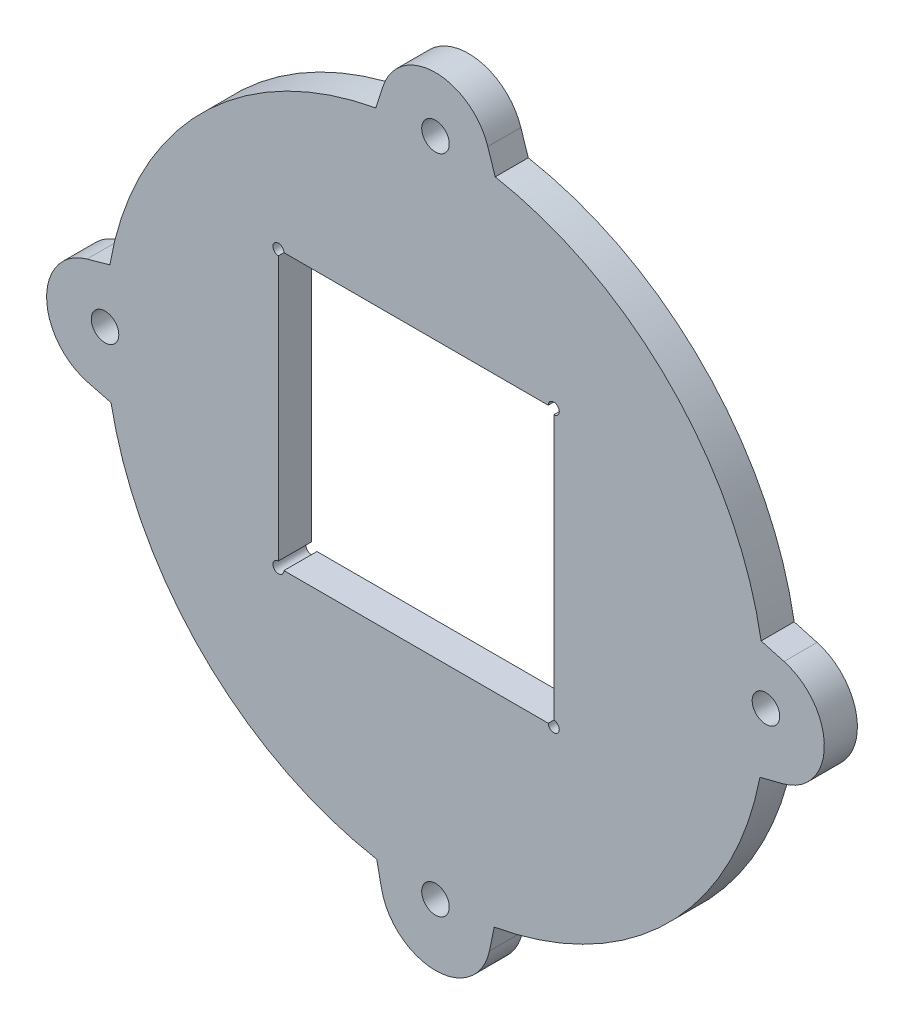
ISO-10303-21;
HEADER;
FILE_DESCRIPTION(('STEP AP214'),'2;1');
FILE_NAME('part.step','',(''),(''),'','','');
FILE_SCHEMA(('AUTOMOTIVE_DESIGN { 1 0 10303 214 1 1 1 1 }'));
ENDSEC;
DATA;
#1=APPLICATION_CONTEXT('core data for automotive mechanical design processes');
#2=APPLICATION_PROTOCOL_DEFINITION('international standard','automotive_design',2000,#1);
#3=PRODUCT_CONTEXT('',#1,'mechanical');
#4=PRODUCT('Part','Part','',(#3));
#5=PRODUCT_RELATED_PRODUCT_CATEGORY('part','',(#4));
#6=PRODUCT_DEFINITION_FORMATION('','',#4);
#7=PRODUCT_DEFINITION_CONTEXT('part definition',#1,'design');
#8=PRODUCT_DEFINITION('design','',#6,#7);
#9=PRODUCT_DEFINITION_SHAPE('','',#8);
#10=(LENGTH_UNIT() NAMED_UNIT(*) SI_UNIT(.MILLI.,.METRE.));
#11=(NAMED_UNIT(*) PLANE_ANGLE_UNIT() SI_UNIT($,.RADIAN.));
#12=(NAMED_UNIT(*) SI_UNIT($,.STERADIAN.) SOLID_ANGLE_UNIT());
#13=UNCERTAINTY_MEASURE_WITH_UNIT(LENGTH_MEASURE(1.E-05),#10,'distance_accuracy_value','');
#14=(GEOMETRIC_REPRESENTATION_CONTEXT(3) GLOBAL_UNCERTAINTY_ASSIGNED_CONTEXT((#13)) GLOBAL_UNIT_ASSIGNED_CONTEXT((#10,
#11,#12)) REPRESENTATION_CONTEXT('',''));
#15=CARTESIAN_POINT('',(0.,0.,0.));
#16=DIRECTION('',(0.,0.,1.));
#17=DIRECTION('',(1.,0.,0.));
#18=AXIS2_PLACEMENT_3D('',#15,#16,#17);
#19=CARTESIAN_POINT('',(-1.85100391915683,25.9314962864006,3.));
#20=DIRECTION('',(0.,0.,-1.));
#21=DIRECTION('',(-1.,0.,0.));
#22=AXIS2_PLACEMENT_3D('',#19,#20,#21);
#23=PLANE('',#22);
#24=CARTESIAN_POINT('',(-1.85100391915683,25.9314962864006,3.));
#25=DIRECTION('',(0.,0.,1.));
#26=DIRECTION('',(1.,0.,0.));
#27=AXIS2_PLACEMENT_3D('',#24,#25,#26);
#28=CIRCLE('',#27,1.25);
#29=CARTESIAN_POINT('',(-0.601003919156824,25.9314962864006,3.));
#30=VERTEX_POINT('',#29);
#31=EDGE_CURVE('E243',#30,#30,#28,.T.);
#32=ORIENTED_EDGE('',*,*,#31,.F.);
#33=EDGE_LOOP('',(#32));
#34=FACE_BOUND('',#33,.T.);
#35=CARTESIAN_POINT('',(-1.85100391915683,25.9314962864006,3.));
#36=DIRECTION('',(0.,0.,1.));
#37=DIRECTION('',(-1.,0.,0.));
#38=AXIS2_PLACEMENT_3D('',#35,#36,#37);
#39=CIRCLE('',#38,5.);
#40=CARTESIAN_POINT('',(2.90088453214125,27.4869885385253,3.));
#41=VERTEX_POINT('',#40);
#42=CARTESIAN_POINT('',(-6.6028923704549,27.4869885385253,3.));
#43=VERTEX_POINT('',#42);
#44=EDGE_CURVE('E249',#41,#43,#39,.T.);
#45=ORIENTED_EDGE('',*,*,#44,.T.);
#46=DIRECTION('',(-0.311098450424942,-0.950377690259614,0.));
#47=VECTOR('',#46,1.);
#48=CARTESIAN_POINT('',(-6.6028923704549,27.4869885385253,3.));
#49=LINE('',#48,#47);
#50=CARTESIAN_POINT('',(-7.27383908397797,25.4373068798274,3.));
#51=VERTEX_POINT('',#50);
#52=EDGE_CURVE('E252',#43,#51,#49,.T.);
#53=ORIENTED_EDGE('',*,*,#52,.T.);
#54=CARTESIAN_POINT('',(-1.85100391915683,-4.06850371359943,3.));
#55=DIRECTION('',(0.,0.,1.));
#56=DIRECTION('',(-1.,0.,0.));
#57=AXIS2_PLACEMENT_3D('',#54,#55,#56);
#58=CIRCLE('',#57,30.);
#59=CARTESIAN_POINT('',(-31.4155105613768,1.02462371482118,3.));
#60=VERTEX_POINT('',#59);
#61=EDGE_CURVE('E255',#51,#60,#58,.T.);
#62=ORIENTED_EDGE('',*,*,#61,.T.);
#63=DIRECTION('',(-0.963403571369794,-0.268055141103332,0.));
#64=VECTOR('',#63,1.);
#65=CARTESIAN_POINT('',(-33.493285166567,0.446508601356048,3.));
#66=LINE('',#65,#64);
#67=CARTESIAN_POINT('',(-33.493285166567,0.446508601356048,3.));
#68=VERTEX_POINT('',#67);
#69=EDGE_CURVE('E257',#60,#68,#66,.T.);
#70=ORIENTED_EDGE('',*,*,#69,.T.);
#71=CARTESIAN_POINT('',(-32.1530094610503,-4.37050925549292,3.));
#72=DIRECTION('',(0.,0.,1.));
#73=DIRECTION('',(-1.,0.,0.));
#74=AXIS2_PLACEMENT_3D('',#71,#72,#73);
#75=CIRCLE('',#74,5.);
#76=CARTESIAN_POINT('',(-33.3970106575512,-9.21328335956842,3.));
#77=VERTEX_POINT('',#76);
#78=EDGE_CURVE('E259',#68,#77,#75,.T.);
#79=ORIENTED_EDGE('',*,*,#78,.T.);
#80=DIRECTION('',(0.968554820815099,-0.248800239300188,0.));
#81=VECTOR('',#80,1.);
#82=CARTESIAN_POINT('',(-33.3970106575512,-9.21328335956842,3.));
#83=LINE('',#82,#81);
#84=CARTESIAN_POINT('',(-31.3081263413319,-9.7498713838874,3.));
#85=VERTEX_POINT('',#84);
#86=EDGE_CURVE('E261',#77,#85,#83,.T.);
#87=ORIENTED_EDGE('',*,*,#86,.T.);
#88=CARTESIAN_POINT('',(-1.85100391915685,-4.06850371359944,3.));
#89=DIRECTION('',(0.,0.,1.));
#90=DIRECTION('',(-1.,0.,0.));
#91=AXIS2_PLACEMENT_3D('',#88,#89,#90);
#92=CIRCLE('',#91,30.);
#93=CARTESIAN_POINT('',(-7.18763088119864,-33.5900282790416,3.));
#94=VERTEX_POINT('',#93);
#95=EDGE_CURVE('E263',#85,#94,#92,.T.);
#96=ORIENTED_EDGE('',*,*,#95,.T.);
#97=DIRECTION('',(0.205625699216915,-0.978630712690724,0.));
#98=VECTOR('',#97,1.);
#99=CARTESIAN_POINT('',(-6.74415748261043,-35.700643293471,3.));
#100=LINE('',#99,#98);
#101=CARTESIAN_POINT('',(-6.74415748261043,-35.700643293471,3.));
#102=VERTEX_POINT('',#101);
#103=EDGE_CURVE('E265',#94,#102,#100,.T.);
#104=ORIENTED_EDGE('',*,*,#103,.T.);
#105=CARTESIAN_POINT('',(-1.85100391915681,-34.6725147973864,3.));
#106=DIRECTION('',(0.,0.,1.));
#107=DIRECTION('',(-1.,0.,0.));
#108=AXIS2_PLACEMENT_3D('',#105,#106,#107);
#109=CIRCLE('',#108,5.);
#110=CARTESIAN_POINT('',(3.04214964429681,-35.700643293471,3.));
#111=VERTEX_POINT('',#110);
#112=EDGE_CURVE('E267',#102,#111,#109,.T.);
#113=ORIENTED_EDGE('',*,*,#112,.T.);
#114=DIRECTION('',(0.205625699216913,0.978630712690724,0.));
#115=VECTOR('',#114,1.);
#116=CARTESIAN_POINT('',(3.04214964429681,-35.700643293471,3.));
#117=LINE('',#116,#115);
#118=CARTESIAN_POINT('',(3.48562304288501,-33.5900282790416,3.));
#119=VERTEX_POINT('',#118);
#120=EDGE_CURVE('E269',#111,#119,#117,.T.);
#121=ORIENTED_EDGE('',*,*,#120,.T.);
#122=CARTESIAN_POINT('',(-1.85100391915683,-4.06850371359943,3.));
#123=DIRECTION('',(0.,0.,1.));
#124=DIRECTION('',(-1.,0.,0.));
#125=AXIS2_PLACEMENT_3D('',#122,#123,#124);
#126=CIRCLE('',#125,30.);
#127=CARTESIAN_POINT('',(27.6061185030182,-9.74987138388738,3.));
#128=VERTEX_POINT('',#127);
#129=EDGE_CURVE('E271',#119,#128,#126,.T.);
#130=ORIENTED_EDGE('',*,*,#129,.T.);
#131=DIRECTION('',(0.9685548208151,0.248800239300185,0.));
#132=VECTOR('',#131,1.);
#133=CARTESIAN_POINT('',(29.6950028192376,-9.21328335956842,3.));
#134=LINE('',#133,#132);
#135=CARTESIAN_POINT('',(29.6950028192376,-9.21328335956842,3.));
#136=VERTEX_POINT('',#135);
#137=EDGE_CURVE('E273',#128,#136,#134,.T.);
#138=ORIENTED_EDGE('',*,*,#137,.T.);
#139=CARTESIAN_POINT('',(28.4510016227367,-4.37050925549292,3.));
#140=DIRECTION('',(0.,0.,1.));
#141=DIRECTION('',(-1.,0.,0.));
#142=AXIS2_PLACEMENT_3D('',#139,#140,#141);
#143=CIRCLE('',#142,5.);
#144=CARTESIAN_POINT('',(29.7912773282533,0.446508601356054,3.));
#145=VERTEX_POINT('',#144);
#146=EDGE_CURVE('E275',#136,#145,#143,.T.);
#147=ORIENTED_EDGE('',*,*,#146,.T.);
#148=DIRECTION('',(-0.963403571369794,0.26805514110333,0.));
#149=VECTOR('',#148,1.);
#150=CARTESIAN_POINT('',(29.7912773282533,0.446508601356054,3.));
#151=LINE('',#150,#149);
#152=CARTESIAN_POINT('',(27.7135027230632,1.02462371482119,3.));
#153=VERTEX_POINT('',#152);
#154=EDGE_CURVE('E277',#145,#153,#151,.T.);
#155=ORIENTED_EDGE('',*,*,#154,.T.);
#156=CARTESIAN_POINT('',(-1.85100391915683,-4.06850371359943,3.));
#157=DIRECTION('',(0.,0.,1.));
#158=DIRECTION('',(-1.,0.,0.));
#159=AXIS2_PLACEMENT_3D('',#156,#157,#158);
#160=CIRCLE('',#159,30.);
#161=CARTESIAN_POINT('',(3.57183124566432,25.4373068798274,3.));
#162=VERTEX_POINT('',#161);
#163=EDGE_CURVE('E279',#153,#162,#160,.T.);
#164=ORIENTED_EDGE('',*,*,#163,.T.);
#165=DIRECTION('',(-0.311098450424942,0.950377690259614,0.));
#166=VECTOR('',#165,1.);
#167=CARTESIAN_POINT('',(2.90088453214125,27.4869885385253,3.));
#168=LINE('',#167,#166);
#169=EDGE_CURVE('E281',#162,#41,#168,.T.);
#170=ORIENTED_EDGE('',*,*,#169,.T.);
#171=EDGE_LOOP('',(#45,#53,#62,#70,#79,#87,#96,#104,#113,#121,#130,#138,#147,#155,#164,#170));
#172=FACE_BOUND('',#171,.T.);
#173=DIRECTION('',(1.,0.,0.));
#174=VECTOR('',#173,1.);
#175=CARTESIAN_POINT('',(-16.1130746243856,-15.1084385502642,3.));
#176=LINE('',#175,#174);
#177=CARTESIAN_POINT('',(-15.6130746243856,-15.1084385502642,3.));
#178=VERTEX_POINT('',#177);
#179=CARTESIAN_POINT('',(8.38692537561444,-15.1084385502642,3.));
#180=VERTEX_POINT('',#179);
#181=EDGE_CURVE('E233',#178,#180,#176,.T.);
#182=ORIENTED_EDGE('',*,*,#181,.F.);
#183=CARTESIAN_POINT('',(-16.1130746243856,-15.1084385502642,3.));
#184=DIRECTION('',(0.,0.,1.));
#185=DIRECTION('',(1.,0.,0.));
#186=AXIS2_PLACEMENT_3D('',#183,#184,#185);
#187=CIRCLE('',#186,0.499999999999999);
#188=CARTESIAN_POINT('',(-16.1130746243856,-14.6084385502642,3.));
#189=VERTEX_POINT('',#188);
#190=EDGE_CURVE('E203',#189,#178,#187,.T.);
#191=ORIENTED_EDGE('',*,*,#190,.F.);
#192=DIRECTION('',(0.,-1.,0.));
#193=VECTOR('',#192,1.);
#194=CARTESIAN_POINT('',(-16.1130746243856,-15.1084385502642,3.));
#195=LINE('',#194,#193);
#196=CARTESIAN_POINT('',(-16.1130746243856,9.39156144973582,3.));
#197=VERTEX_POINT('',#196);
#198=EDGE_CURVE('E222',#197,#189,#195,.T.);
#199=ORIENTED_EDGE('',*,*,#198,.F.);
#200=CARTESIAN_POINT('',(-16.1130746243856,9.89156144973582,3.));
#201=DIRECTION('',(0.,0.,1.));
#202=DIRECTION('',(1.,0.,0.));
#203=AXIS2_PLACEMENT_3D('',#200,#201,#202);
#204=CIRCLE('',#203,0.499999999999999);
#205=CARTESIAN_POINT('',(-15.6130746243856,9.89156144973582,3.));
#206=VERTEX_POINT('',#205);
#207=EDGE_CURVE('E55',#206,#197,#204,.T.);
#208=ORIENTED_EDGE('',*,*,#207,.F.);
#209=DIRECTION('',(-1.,0.,0.));
#210=VECTOR('',#209,1.);
#211=CARTESIAN_POINT('',(-16.1130746243856,9.89156144973582,3.));
#212=LINE('',#211,#210);
#213=CARTESIAN_POINT('',(8.38692537561444,9.89156144973582,3.));
#214=VERTEX_POINT('',#213);
#215=EDGE_CURVE('E218',#214,#206,#212,.T.);
#216=ORIENTED_EDGE('',*,*,#215,.F.);
#217=CARTESIAN_POINT('',(8.88692537561444,9.89156144973582,3.));
#218=DIRECTION('',(0.,0.,1.));
#219=DIRECTION('',(1.,0.,0.));
#220=AXIS2_PLACEMENT_3D('',#217,#218,#219);
#221=CIRCLE('',#220,0.500000000000001);
#222=CARTESIAN_POINT('',(8.88692537561444,9.39156144973582,3.));
#223=VERTEX_POINT('',#222);
#224=EDGE_CURVE('E47',#223,#214,#221,.T.);
#225=ORIENTED_EDGE('',*,*,#224,.F.);
#226=DIRECTION('',(0.,1.,0.));
#227=VECTOR('',#226,1.);
#228=CARTESIAN_POINT('',(8.88692537561444,-15.1084385502642,3.));
#229=LINE('',#228,#227);
#230=CARTESIAN_POINT('',(8.88692537561444,-14.6084385502642,3.));
#231=VERTEX_POINT('',#230);
#232=EDGE_CURVE('E210',#231,#223,#229,.T.);
#233=ORIENTED_EDGE('',*,*,#232,.F.);
#234=CARTESIAN_POINT('',(8.88692537561444,-15.1084385502642,3.));
#235=DIRECTION('',(0.,0.,1.));
#236=DIRECTION('',(1.,0.,0.));
#237=AXIS2_PLACEMENT_3D('',#234,#235,#236);
#238=CIRCLE('',#237,0.500000000000001);
#239=EDGE_CURVE('E192',#180,#231,#238,.T.);
#240=ORIENTED_EDGE('',*,*,#239,.F.);
#241=EDGE_LOOP('',(#182,#191,#199,#208,#216,#225,#233,#240));
#242=FACE_BOUND('',#241,.T.);
#243=CARTESIAN_POINT('',(28.1489960808432,-4.06850371359943,3.));
#244=DIRECTION('',(0.,0.,1.));
#245=DIRECTION('',(1.,0.,0.));
#246=AXIS2_PLACEMENT_3D('',#243,#244,#245);
#247=CIRCLE('',#246,1.25);
#248=CARTESIAN_POINT('',(29.3989960808432,-4.06850371359943,3.));
#249=VERTEX_POINT('',#248);
#250=EDGE_CURVE('E238',#249,#249,#247,.T.);
#251=ORIENTED_EDGE('',*,*,#250,.F.);
#252=EDGE_LOOP('',(#251));
#253=FACE_BOUND('',#252,.T.);
#254=CARTESIAN_POINT('',(-1.85100391915682,-34.0685037135994,3.));
#255=DIRECTION('',(0.,0.,1.));
#256=DIRECTION('',(1.,0.,0.));
#257=AXIS2_PLACEMENT_3D('',#254,#255,#256);
#258=CIRCLE('',#257,1.25);
#259=CARTESIAN_POINT('',(-0.601003919156821,-34.0685037135994,3.));
#260=VERTEX_POINT('',#259);
#261=EDGE_CURVE('E399',#260,#260,#258,.T.);
#262=ORIENTED_EDGE('',*,*,#261,.F.);
#263=EDGE_LOOP('',(#262));
#264=FACE_BOUND('',#263,.T.);
#265=CARTESIAN_POINT('',(-31.8510039191568,-4.06850371359943,3.));
#266=DIRECTION('',(0.,0.,1.));
#267=DIRECTION('',(1.,0.,0.));
#268=AXIS2_PLACEMENT_3D('',#265,#266,#267);
#269=CIRCLE('',#268,1.25);
#270=CARTESIAN_POINT('',(-30.6010039191568,-4.06850371359943,3.));
#271=VERTEX_POINT('',#270);
#272=EDGE_CURVE('E393',#271,#271,#269,.T.);
#273=ORIENTED_EDGE('',*,*,#272,.F.);
#274=EDGE_LOOP('',(#273));
#275=FACE_BOUND('',#274,.T.);
#276=ADVANCED_FACE('F33',(#34,#172,#242,#253,#264,#275),#23,.F.);
#277=CARTESIAN_POINT('',(-1.85100391915683,25.9314962864006,0.));
#278=DIRECTION('',(0.,0.,-1.));
#279=DIRECTION('',(-1.,0.,0.));
#280=AXIS2_PLACEMENT_3D('',#277,#278,#279);
#281=PLANE('',#280);
#282=CARTESIAN_POINT('',(-16.1130746243856,-15.1084385502642,0.));
#283=DIRECTION('',(0.,0.,-1.));
#284=DIRECTION('',(-1.,0.,0.));
#285=AXIS2_PLACEMENT_3D('',#282,#283,#284);
#286=CIRCLE('',#285,0.499999999999999);
#287=CARTESIAN_POINT('',(-15.6130746243856,-15.1084385502642,0.));
#288=VERTEX_POINT('',#287);
#289=CARTESIAN_POINT('',(-16.1130746243856,-14.6084385502642,0.));
#290=VERTEX_POINT('',#289);
#291=EDGE_CURVE('E213',#288,#290,#286,.T.);
#292=ORIENTED_EDGE('',*,*,#291,.F.);
#293=DIRECTION('',(1.,0.,0.));
#294=VECTOR('',#293,1.);
#295=CARTESIAN_POINT('',(-16.1130746243856,-15.1084385502642,0.));
#296=LINE('',#295,#294);
#297=CARTESIAN_POINT('',(8.38692537561444,-15.1084385502642,0.));
#298=VERTEX_POINT('',#297);
#299=EDGE_CURVE('E219',#288,#298,#296,.T.);
#300=ORIENTED_EDGE('',*,*,#299,.T.);
#301=CARTESIAN_POINT('',(8.88692537561444,-15.1084385502642,0.));
#302=DIRECTION('',(0.,0.,-1.));
#303=DIRECTION('',(-1.,0.,0.));
#304=AXIS2_PLACEMENT_3D('',#301,#302,#303);
#305=CIRCLE('',#304,0.500000000000001);
#306=CARTESIAN_POINT('',(8.88692537561444,-14.6084385502642,0.));
#307=VERTEX_POINT('',#306);
#308=EDGE_CURVE('E214',#307,#298,#305,.T.);
#309=ORIENTED_EDGE('',*,*,#308,.F.);
#310=DIRECTION('',(0.,1.,0.));
#311=VECTOR('',#310,1.);
#312=CARTESIAN_POINT('',(8.88692537561444,-15.1084385502642,0.));
#313=LINE('',#312,#311);
#314=CARTESIAN_POINT('',(8.88692537561444,9.39156144973582,0.));
#315=VERTEX_POINT('',#314);
#316=EDGE_CURVE('E212',#307,#315,#313,.T.);
#317=ORIENTED_EDGE('',*,*,#316,.T.);
#318=CARTESIAN_POINT('',(8.88692537561444,9.89156144973582,0.));
#319=DIRECTION('',(0.,0.,-1.));
#320=DIRECTION('',(-1.,0.,0.));
#321=AXIS2_PLACEMENT_3D('',#318,#319,#320);
#322=CIRCLE('',#321,0.500000000000001);
#323=CARTESIAN_POINT('',(8.38692537561444,9.89156144973582,0.));
#324=VERTEX_POINT('',#323);
#325=EDGE_CURVE('E388',#324,#315,#322,.T.);
#326=ORIENTED_EDGE('',*,*,#325,.F.);
#327=DIRECTION('',(-1.,0.,0.));
#328=VECTOR('',#327,1.);
#329=CARTESIAN_POINT('',(-16.1130746243856,9.89156144973582,0.));
#330=LINE('',#329,#328);
#331=CARTESIAN_POINT('',(-15.6130746243856,9.89156144973582,0.));
#332=VERTEX_POINT('',#331);
#333=EDGE_CURVE('E237',#324,#332,#330,.T.);
#334=ORIENTED_EDGE('',*,*,#333,.T.);
#335=CARTESIAN_POINT('',(-16.1130746243856,9.89156144973582,0.));
#336=DIRECTION('',(0.,0.,-1.));
#337=DIRECTION('',(-1.,0.,0.));
#338=AXIS2_PLACEMENT_3D('',#335,#336,#337);
#339=CIRCLE('',#338,0.499999999999999);
#340=CARTESIAN_POINT('',(-16.1130746243856,9.39156144973582,0.));
#341=VERTEX_POINT('',#340);
#342=EDGE_CURVE('E366',#341,#332,#339,.T.);
#343=ORIENTED_EDGE('',*,*,#342,.F.);
#344=DIRECTION('',(0.,-1.,0.));
#345=VECTOR('',#344,1.);
#346=CARTESIAN_POINT('',(-16.1130746243856,-15.1084385502642,0.));
#347=LINE('',#346,#345);
#348=EDGE_CURVE('E225',#341,#290,#347,.T.);
#349=ORIENTED_EDGE('',*,*,#348,.T.);
#350=EDGE_LOOP('',(#292,#300,#309,#317,#326,#334,#343,#349));
#351=FACE_BOUND('',#350,.T.);
#352=CARTESIAN_POINT('',(-1.85100391915682,-34.0685037135994,0.));
#353=DIRECTION('',(0.,0.,1.));
#354=DIRECTION('',(1.,0.,0.));
#355=AXIS2_PLACEMENT_3D('',#352,#353,#354);
#356=CIRCLE('',#355,1.25);
#357=CARTESIAN_POINT('',(-0.601003919156821,-34.0685037135994,0.));
#358=VERTEX_POINT('',#357);
#359=EDGE_CURVE('E396',#358,#358,#356,.T.);
#360=ORIENTED_EDGE('',*,*,#359,.T.);
#361=EDGE_LOOP('',(#360));
#362=FACE_BOUND('',#361,.T.);
#363=CARTESIAN_POINT('',(-1.85100391915683,25.9314962864006,0.));
#364=DIRECTION('',(0.,0.,1.));
#365=DIRECTION('',(1.,0.,0.));
#366=AXIS2_PLACEMENT_3D('',#363,#364,#365);
#367=CIRCLE('',#366,1.25);
#368=CARTESIAN_POINT('',(-0.601003919156824,25.9314962864006,0.));
#369=VERTEX_POINT('',#368);
#370=EDGE_CURVE('E235',#369,#369,#367,.T.);
#371=ORIENTED_EDGE('',*,*,#370,.T.);
#372=EDGE_LOOP('',(#371));
#373=FACE_BOUND('',#372,.T.);
#374=CARTESIAN_POINT('',(-1.85100391915683,25.9314962864006,0.));
#375=DIRECTION('',(0.,0.,1.));
#376=DIRECTION('',(-1.,0.,0.));
#377=AXIS2_PLACEMENT_3D('',#374,#375,#376);
#378=CIRCLE('',#377,5.);
#379=CARTESIAN_POINT('',(2.90088453214125,27.4869885385253,0.));
#380=VERTEX_POINT('',#379);
#381=CARTESIAN_POINT('',(-6.6028923704549,27.4869885385253,0.));
#382=VERTEX_POINT('',#381);
#383=EDGE_CURVE('E246',#380,#382,#378,.T.);
#384=ORIENTED_EDGE('',*,*,#383,.F.);
#385=DIRECTION('',(-0.311098450424942,0.950377690259614,0.));
#386=VECTOR('',#385,1.);
#387=CARTESIAN_POINT('',(2.90088453214125,27.4869885385253,0.));
#388=LINE('',#387,#386);
#389=CARTESIAN_POINT('',(3.57183124566432,25.4373068798274,0.));
#390=VERTEX_POINT('',#389);
#391=EDGE_CURVE('E253',#390,#380,#388,.T.);
#392=ORIENTED_EDGE('',*,*,#391,.F.);
#393=CARTESIAN_POINT('',(-1.85100391915683,-4.06850371359943,0.));
#394=DIRECTION('',(0.,0.,1.));
#395=DIRECTION('',(-1.,0.,0.));
#396=AXIS2_PLACEMENT_3D('',#393,#394,#395);
#397=CIRCLE('',#396,30.);
#398=CARTESIAN_POINT('',(27.7135027230632,1.02462371482119,0.));
#399=VERTEX_POINT('',#398);
#400=EDGE_CURVE('E312',#399,#390,#397,.T.);
#401=ORIENTED_EDGE('',*,*,#400,.F.);
#402=DIRECTION('',(-0.963403571369794,0.26805514110333,0.));
#403=VECTOR('',#402,1.);
#404=CARTESIAN_POINT('',(29.7912773282533,0.446508601356054,0.));
#405=LINE('',#404,#403);
#406=CARTESIAN_POINT('',(29.7912773282533,0.446508601356054,0.));
#407=VERTEX_POINT('',#406);
#408=EDGE_CURVE('E310',#407,#399,#405,.T.);
#409=ORIENTED_EDGE('',*,*,#408,.F.);
#410=CARTESIAN_POINT('',(28.4510016227367,-4.37050925549292,0.));
#411=DIRECTION('',(0.,0.,1.));
#412=DIRECTION('',(-1.,0.,0.));
#413=AXIS2_PLACEMENT_3D('',#410,#411,#412);
#414=CIRCLE('',#413,5.);
#415=CARTESIAN_POINT('',(29.6950028192376,-9.21328335956842,0.));
#416=VERTEX_POINT('',#415);
#417=EDGE_CURVE('E308',#416,#407,#414,.T.);
#418=ORIENTED_EDGE('',*,*,#417,.F.);
#419=DIRECTION('',(0.9685548208151,0.248800239300185,0.));
#420=VECTOR('',#419,1.);
#421=CARTESIAN_POINT('',(29.6950028192376,-9.21328335956842,0.));
#422=LINE('',#421,#420);
#423=CARTESIAN_POINT('',(27.6061185030182,-9.74987138388738,0.));
#424=VERTEX_POINT('',#423);
#425=EDGE_CURVE('E306',#424,#416,#422,.T.);
#426=ORIENTED_EDGE('',*,*,#425,.F.);
#427=CARTESIAN_POINT('',(-1.85100391915683,-4.06850371359943,0.));
#428=DIRECTION('',(0.,0.,1.));
#429=DIRECTION('',(-1.,0.,0.));
#430=AXIS2_PLACEMENT_3D('',#427,#428,#429);
#431=CIRCLE('',#430,30.);
#432=CARTESIAN_POINT('',(3.48562304288501,-33.5900282790416,0.));
#433=VERTEX_POINT('',#432);
#434=EDGE_CURVE('E304',#433,#424,#431,.T.);
#435=ORIENTED_EDGE('',*,*,#434,.F.);
#436=DIRECTION('',(0.205625699216913,0.978630712690724,0.));
#437=VECTOR('',#436,1.);
#438=CARTESIAN_POINT('',(3.04214964429681,-35.700643293471,0.));
#439=LINE('',#438,#437);
#440=CARTESIAN_POINT('',(3.04214964429681,-35.700643293471,0.));
#441=VERTEX_POINT('',#440);
#442=EDGE_CURVE('E302',#441,#433,#439,.T.);
#443=ORIENTED_EDGE('',*,*,#442,.F.);
#444=CARTESIAN_POINT('',(-1.85100391915681,-34.6725147973864,0.));
#445=DIRECTION('',(0.,0.,1.));
#446=DIRECTION('',(-1.,0.,0.));
#447=AXIS2_PLACEMENT_3D('',#444,#445,#446);
#448=CIRCLE('',#447,5.);
#449=CARTESIAN_POINT('',(-6.74415748261043,-35.700643293471,0.));
#450=VERTEX_POINT('',#449);
#451=EDGE_CURVE('E300',#450,#441,#448,.T.);
#452=ORIENTED_EDGE('',*,*,#451,.F.);
#453=DIRECTION('',(0.205625699216915,-0.978630712690724,0.));
#454=VECTOR('',#453,1.);
#455=CARTESIAN_POINT('',(-6.74415748261043,-35.700643293471,0.));
#456=LINE('',#455,#454);
#457=CARTESIAN_POINT('',(-7.18763088119864,-33.5900282790416,0.));
#458=VERTEX_POINT('',#457);
#459=EDGE_CURVE('E298',#458,#450,#456,.T.);
#460=ORIENTED_EDGE('',*,*,#459,.F.);
#461=CARTESIAN_POINT('',(-1.85100391915685,-4.06850371359944,0.));
#462=DIRECTION('',(0.,0.,1.));
#463=DIRECTION('',(-1.,0.,0.));
#464=AXIS2_PLACEMENT_3D('',#461,#462,#463);
#465=CIRCLE('',#464,30.);
#466=CARTESIAN_POINT('',(-31.3081263413319,-9.7498713838874,0.));
#467=VERTEX_POINT('',#466);
#468=EDGE_CURVE('E296',#467,#458,#465,.T.);
#469=ORIENTED_EDGE('',*,*,#468,.F.);
#470=DIRECTION('',(0.968554820815099,-0.248800239300188,0.));
#471=VECTOR('',#470,1.);
#472=CARTESIAN_POINT('',(-33.3970106575512,-9.21328335956842,0.));
#473=LINE('',#472,#471);
#474=CARTESIAN_POINT('',(-33.3970106575512,-9.21328335956842,0.));
#475=VERTEX_POINT('',#474);
#476=EDGE_CURVE('E294',#475,#467,#473,.T.);
#477=ORIENTED_EDGE('',*,*,#476,.F.);
#478=CARTESIAN_POINT('',(-32.1530094610503,-4.37050925549292,0.));
#479=DIRECTION('',(0.,0.,1.));
#480=DIRECTION('',(-1.,0.,0.));
#481=AXIS2_PLACEMENT_3D('',#478,#479,#480);
#482=CIRCLE('',#481,5.);
#483=CARTESIAN_POINT('',(-33.493285166567,0.446508601356048,0.));
#484=VERTEX_POINT('',#483);
#485=EDGE_CURVE('E292',#484,#475,#482,.T.);
#486=ORIENTED_EDGE('',*,*,#485,.F.);
#487=DIRECTION('',(-0.963403571369794,-0.268055141103332,0.));
#488=VECTOR('',#487,1.);
#489=CARTESIAN_POINT('',(-33.493285166567,0.446508601356048,0.));
#490=LINE('',#489,#488);
#491=CARTESIAN_POINT('',(-31.4155105613768,1.02462371482118,0.));
#492=VERTEX_POINT('',#491);
#493=EDGE_CURVE('E290',#492,#484,#490,.T.);
#494=ORIENTED_EDGE('',*,*,#493,.F.);
#495=CARTESIAN_POINT('',(-1.85100391915683,-4.06850371359943,0.));
#496=DIRECTION('',(0.,0.,1.));
#497=DIRECTION('',(-1.,0.,0.));
#498=AXIS2_PLACEMENT_3D('',#495,#496,#497);
#499=CIRCLE('',#498,30.);
#500=CARTESIAN_POINT('',(-7.27383908397797,25.4373068798274,0.));
#501=VERTEX_POINT('',#500);
#502=EDGE_CURVE('E288',#501,#492,#499,.T.);
#503=ORIENTED_EDGE('',*,*,#502,.F.);
#504=DIRECTION('',(-0.311098450424942,-0.950377690259614,0.));
#505=VECTOR('',#504,1.);
#506=CARTESIAN_POINT('',(-6.6028923704549,27.4869885385253,0.));
#507=LINE('',#506,#505);
#508=EDGE_CURVE('E286',#382,#501,#507,.T.);
#509=ORIENTED_EDGE('',*,*,#508,.F.);
#510=EDGE_LOOP('',(#384,#392,#401,#409,#418,#426,#435,#443,#452,#460,#469,#477,#486,#494,#503,#509));
#511=FACE_BOUND('',#510,.T.);
#512=CARTESIAN_POINT('',(28.1489960808432,-4.06850371359943,0.));
#513=DIRECTION('',(0.,0.,1.));
#514=DIRECTION('',(1.,0.,0.));
#515=AXIS2_PLACEMENT_3D('',#512,#513,#514);
#516=CIRCLE('',#515,1.25);
#517=CARTESIAN_POINT('',(29.3989960808432,-4.06850371359943,0.));
#518=VERTEX_POINT('',#517);
#519=EDGE_CURVE('E228',#518,#518,#516,.T.);
#520=ORIENTED_EDGE('',*,*,#519,.T.);
#521=EDGE_LOOP('',(#520));
#522=FACE_BOUND('',#521,.T.);
#523=CARTESIAN_POINT('',(-31.8510039191568,-4.06850371359943,0.));
#524=DIRECTION('',(0.,0.,1.));
#525=DIRECTION('',(1.,0.,0.));
#526=AXIS2_PLACEMENT_3D('',#523,#524,#525);
#527=CIRCLE('',#526,1.25);
#528=CARTESIAN_POINT('',(-30.6010039191568,-4.06850371359943,0.));
#529=VERTEX_POINT('',#528);
#530=EDGE_CURVE('E392',#529,#529,#527,.T.);
#531=ORIENTED_EDGE('',*,*,#530,.T.);
#532=EDGE_LOOP('',(#531));
#533=FACE_BOUND('',#532,.T.);
#534=ADVANCED_FACE('F373',(#351,#362,#373,#511,#522,#533),#281,.T.);
#535=CARTESIAN_POINT('',(-1.85100391915683,25.9314962864006,3.));
#536=DIRECTION('',(0.,0.,-1.));
#537=DIRECTION('',(-1.,0.,0.));
#538=AXIS2_PLACEMENT_3D('',#535,#536,#537);
#539=CYLINDRICAL_SURFACE('',#538,5.);
#540=ORIENTED_EDGE('',*,*,#383,.T.);
#541=DIRECTION('',(0.,0.,-1.));
#542=VECTOR('',#541,1.);
#543=CARTESIAN_POINT('',(-6.6028923704549,27.4869885385253,3.));
#544=LINE('',#543,#542);
#545=EDGE_CURVE('E359',#43,#382,#544,.T.);
#546=ORIENTED_EDGE('',*,*,#545,.F.);
#547=ORIENTED_EDGE('',*,*,#44,.F.);
#548=DIRECTION('',(0.,0.,-1.));
#549=VECTOR('',#548,1.);
#550=CARTESIAN_POINT('',(2.90088453214125,27.4869885385253,3.));
#551=LINE('',#550,#549);
#552=EDGE_CURVE('E283',#41,#380,#551,.T.);
#553=ORIENTED_EDGE('',*,*,#552,.T.);
#554=EDGE_LOOP('',(#540,#546,#547,#553));
#555=FACE_BOUND('',#554,.T.);
#556=ADVANCED_FACE('F35',(#555),#539,.T.);
#557=CARTESIAN_POINT('',(-6.6028923704549,27.4869885385253,3.));
#558=DIRECTION('',(0.950377690259614,-0.311098450424942,0.));
#559=DIRECTION('',(0.311098450424943,0.950377690259615,0.));
#560=AXIS2_PLACEMENT_3D('',#557,#558,#559);
#561=PLANE('',#560);
#562=ORIENTED_EDGE('',*,*,#508,.T.);
#563=DIRECTION('',(0.,0.,-1.));
#564=VECTOR('',#563,1.);
#565=CARTESIAN_POINT('',(-7.27383908397797,25.4373068798274,3.));
#566=LINE('',#565,#564);
#567=EDGE_CURVE('E356',#51,#501,#566,.T.);
#568=ORIENTED_EDGE('',*,*,#567,.F.);
#569=ORIENTED_EDGE('',*,*,#52,.F.);
#570=ORIENTED_EDGE('',*,*,#545,.T.);
#571=EDGE_LOOP('',(#562,#568,#569,#570));
#572=FACE_BOUND('',#571,.T.);
#573=ADVANCED_FACE('F492',(#572),#561,.F.);
#574=CARTESIAN_POINT('',(-1.85100391915683,-4.06850371359943,3.));
#575=DIRECTION('',(0.,0.,-1.));
#576=DIRECTION('',(-1.,0.,0.));
#577=AXIS2_PLACEMENT_3D('',#574,#575,#576);
#578=CYLINDRICAL_SURFACE('',#577,30.);
#579=ORIENTED_EDGE('',*,*,#502,.T.);
#580=DIRECTION('',(0.,0.,-1.));
#581=VECTOR('',#580,1.);
#582=CARTESIAN_POINT('',(-31.4155105613768,1.02462371482118,3.));
#583=LINE('',#582,#581);
#584=EDGE_CURVE('E353',#60,#492,#583,.T.);
#585=ORIENTED_EDGE('',*,*,#584,.F.);
#586=ORIENTED_EDGE('',*,*,#61,.F.);
#587=ORIENTED_EDGE('',*,*,#567,.T.);
#588=EDGE_LOOP('',(#579,#585,#586,#587));
#589=FACE_BOUND('',#588,.T.);
#590=ADVANCED_FACE('F489',(#589),#578,.T.);
#591=CARTESIAN_POINT('',(-33.493285166567,0.446508601356048,3.));
#592=DIRECTION('',(0.268055141103332,-0.963403571369793,0.));
#593=DIRECTION('',(0.963403571369794,0.268055141103332,0.));
#594=AXIS2_PLACEMENT_3D('',#591,#592,#593);
#595=PLANE('',#594);
#596=ORIENTED_EDGE('',*,*,#493,.T.);
#597=DIRECTION('',(0.,0.,-1.));
#598=VECTOR('',#597,1.);
#599=CARTESIAN_POINT('',(-33.493285166567,0.446508601356048,3.));
#600=LINE('',#599,#598);
#601=EDGE_CURVE('E350',#68,#484,#600,.T.);
#602=ORIENTED_EDGE('',*,*,#601,.F.);
#603=ORIENTED_EDGE('',*,*,#69,.F.);
#604=ORIENTED_EDGE('',*,*,#584,.T.);
#605=EDGE_LOOP('',(#596,#602,#603,#604));
#606=FACE_BOUND('',#605,.T.);
#607=ADVANCED_FACE('F485',(#606),#595,.F.);
#608=CARTESIAN_POINT('',(-32.1530094610503,-4.37050925549292,3.));
#609=DIRECTION('',(0.,0.,-1.));
#610=DIRECTION('',(-1.,0.,0.));
#611=AXIS2_PLACEMENT_3D('',#608,#609,#610);
#612=CYLINDRICAL_SURFACE('',#611,5.);
#613=ORIENTED_EDGE('',*,*,#485,.T.);
#614=DIRECTION('',(0.,0.,-1.));
#615=VECTOR('',#614,1.);
#616=CARTESIAN_POINT('',(-33.3970106575512,-9.21328335956842,3.));
#617=LINE('',#616,#615);
#618=EDGE_CURVE('E347',#77,#475,#617,.T.);
#619=ORIENTED_EDGE('',*,*,#618,.F.);
#620=ORIENTED_EDGE('',*,*,#78,.F.);
#621=ORIENTED_EDGE('',*,*,#601,.T.);
#622=EDGE_LOOP('',(#613,#619,#620,#621));
#623=FACE_BOUND('',#622,.T.);
#624=ADVANCED_FACE('F481',(#623),#612,.T.);
#625=CARTESIAN_POINT('',(-33.3970106575512,-9.21328335956842,3.));
#626=DIRECTION('',(0.248800239300188,0.968554820815099,0.));
#627=DIRECTION('',(-0.968554820815099,0.248800239300188,0.));
#628=AXIS2_PLACEMENT_3D('',#625,#626,#627);
#629=PLANE('',#628);
#630=ORIENTED_EDGE('',*,*,#476,.T.);
#631=DIRECTION('',(0.,0.,-1.));
#632=VECTOR('',#631,1.);
#633=CARTESIAN_POINT('',(-31.3081263413319,-9.7498713838874,3.));
#634=LINE('',#633,#632);
#635=EDGE_CURVE('E344',#85,#467,#634,.T.);
#636=ORIENTED_EDGE('',*,*,#635,.F.);
#637=ORIENTED_EDGE('',*,*,#86,.F.);
#638=ORIENTED_EDGE('',*,*,#618,.T.);
#639=EDGE_LOOP('',(#630,#636,#637,#638));
#640=FACE_BOUND('',#639,.T.);
#641=ADVANCED_FACE('F477',(#640),#629,.F.);
#642=CARTESIAN_POINT('',(-1.85100391915685,-4.06850371359944,3.));
#643=DIRECTION('',(0.,0.,-1.));
#644=DIRECTION('',(-1.,0.,0.));
#645=AXIS2_PLACEMENT_3D('',#642,#643,#644);
#646=CYLINDRICAL_SURFACE('',#645,30.);
#647=ORIENTED_EDGE('',*,*,#468,.T.);
#648=DIRECTION('',(0.,0.,-1.));
#649=VECTOR('',#648,1.);
#650=CARTESIAN_POINT('',(-7.18763088119864,-33.5900282790416,3.));
#651=LINE('',#650,#649);
#652=EDGE_CURVE('E341',#94,#458,#651,.T.);
#653=ORIENTED_EDGE('',*,*,#652,.F.);
#654=ORIENTED_EDGE('',*,*,#95,.F.);
#655=ORIENTED_EDGE('',*,*,#635,.T.);
#656=EDGE_LOOP('',(#647,#653,#654,#655));
#657=FACE_BOUND('',#656,.T.);
#658=ADVANCED_FACE('F473',(#657),#646,.T.);
#659=CARTESIAN_POINT('',(-6.74415748261043,-35.700643293471,3.));
#660=DIRECTION('',(0.978630712690724,0.205625699216915,0.));
#661=DIRECTION('',(-0.205625699216915,0.978630712690724,0.));
#662=AXIS2_PLACEMENT_3D('',#659,#660,#661);
#663=PLANE('',#662);
#664=ORIENTED_EDGE('',*,*,#459,.T.);
#665=DIRECTION('',(0.,0.,-1.));
#666=VECTOR('',#665,1.);
#667=CARTESIAN_POINT('',(-6.74415748261043,-35.700643293471,3.));
#668=LINE('',#667,#666);
#669=EDGE_CURVE('E338',#102,#450,#668,.T.);
#670=ORIENTED_EDGE('',*,*,#669,.F.);
#671=ORIENTED_EDGE('',*,*,#103,.F.);
#672=ORIENTED_EDGE('',*,*,#652,.T.);
#673=EDGE_LOOP('',(#664,#670,#671,#672));
#674=FACE_BOUND('',#673,.T.);
#675=ADVANCED_FACE('F469',(#674),#663,.F.);
#676=CARTESIAN_POINT('',(-1.85100391915681,-34.6725147973864,3.));
#677=DIRECTION('',(0.,0.,-1.));
#678=DIRECTION('',(-1.,0.,0.));
#679=AXIS2_PLACEMENT_3D('',#676,#677,#678);
#680=CYLINDRICAL_SURFACE('',#679,5.);
#681=ORIENTED_EDGE('',*,*,#451,.T.);
#682=DIRECTION('',(0.,0.,-1.));
#683=VECTOR('',#682,1.);
#684=CARTESIAN_POINT('',(3.04214964429681,-35.700643293471,3.));
#685=LINE('',#684,#683);
#686=EDGE_CURVE('E335',#111,#441,#685,.T.);
#687=ORIENTED_EDGE('',*,*,#686,.F.);
#688=ORIENTED_EDGE('',*,*,#112,.F.);
#689=ORIENTED_EDGE('',*,*,#669,.T.);
#690=EDGE_LOOP('',(#681,#687,#688,#689));
#691=FACE_BOUND('',#690,.T.);
#692=ADVANCED_FACE('F465',(#691),#680,.T.);
#693=CARTESIAN_POINT('',(3.04214964429681,-35.700643293471,3.));
#694=DIRECTION('',(-0.978630712690725,0.205625699216913,0.));
#695=DIRECTION('',(-0.205625699216913,-0.978630712690725,0.));
#696=AXIS2_PLACEMENT_3D('',#693,#694,#695);
#697=PLANE('',#696);
#698=ORIENTED_EDGE('',*,*,#442,.T.);
#699=DIRECTION('',(0.,0.,-1.));
#700=VECTOR('',#699,1.);
#701=CARTESIAN_POINT('',(3.48562304288501,-33.5900282790416,3.));
#702=LINE('',#701,#700);
#703=EDGE_CURVE('E332',#119,#433,#702,.T.);
#704=ORIENTED_EDGE('',*,*,#703,.F.);
#705=ORIENTED_EDGE('',*,*,#120,.F.);
#706=ORIENTED_EDGE('',*,*,#686,.T.);
#707=EDGE_LOOP('',(#698,#704,#705,#706));
#708=FACE_BOUND('',#707,.T.);
#709=ADVANCED_FACE('F461',(#708),#697,.F.);
#710=CARTESIAN_POINT('',(-1.85100391915683,-4.06850371359943,3.));
#711=DIRECTION('',(0.,0.,-1.));
#712=DIRECTION('',(-1.,0.,0.));
#713=AXIS2_PLACEMENT_3D('',#710,#711,#712);
#714=CYLINDRICAL_SURFACE('',#713,30.);
#715=ORIENTED_EDGE('',*,*,#434,.T.);
#716=DIRECTION('',(0.,0.,-1.));
#717=VECTOR('',#716,1.);
#718=CARTESIAN_POINT('',(27.6061185030182,-9.74987138388738,3.));
#719=LINE('',#718,#717);
#720=EDGE_CURVE('E329',#128,#424,#719,.T.);
#721=ORIENTED_EDGE('',*,*,#720,.F.);
#722=ORIENTED_EDGE('',*,*,#129,.F.);
#723=ORIENTED_EDGE('',*,*,#703,.T.);
#724=EDGE_LOOP('',(#715,#721,#722,#723));
#725=FACE_BOUND('',#724,.T.);
#726=ADVANCED_FACE('F457',(#725),#714,.T.);
#727=CARTESIAN_POINT('',(29.6950028192376,-9.21328335956842,3.));
#728=DIRECTION('',(-0.248800239300185,0.9685548208151,0.));
#729=DIRECTION('',(-0.9685548208151,-0.248800239300185,0.));
#730=AXIS2_PLACEMENT_3D('',#727,#728,#729);
#731=PLANE('',#730);
#732=ORIENTED_EDGE('',*,*,#425,.T.);
#733=DIRECTION('',(0.,0.,-1.));
#734=VECTOR('',#733,1.);
#735=CARTESIAN_POINT('',(29.6950028192376,-9.21328335956842,3.));
#736=LINE('',#735,#734);
#737=EDGE_CURVE('E326',#136,#416,#736,.T.);
#738=ORIENTED_EDGE('',*,*,#737,.F.);
#739=ORIENTED_EDGE('',*,*,#137,.F.);
#740=ORIENTED_EDGE('',*,*,#720,.T.);
#741=EDGE_LOOP('',(#732,#738,#739,#740));
#742=FACE_BOUND('',#741,.T.);
#743=ADVANCED_FACE('F453',(#742),#731,.F.);
#744=CARTESIAN_POINT('',(28.4510016227367,-4.37050925549292,3.));
#745=DIRECTION('',(0.,0.,-1.));
#746=DIRECTION('',(-1.,0.,0.));
#747=AXIS2_PLACEMENT_3D('',#744,#745,#746);
#748=CYLINDRICAL_SURFACE('',#747,5.);
#749=ORIENTED_EDGE('',*,*,#417,.T.);
#750=DIRECTION('',(0.,0.,-1.));
#751=VECTOR('',#750,1.);
#752=CARTESIAN_POINT('',(29.7912773282533,0.446508601356054,3.));
#753=LINE('',#752,#751);
#754=EDGE_CURVE('E323',#145,#407,#753,.T.);
#755=ORIENTED_EDGE('',*,*,#754,.F.);
#756=ORIENTED_EDGE('',*,*,#146,.F.);
#757=ORIENTED_EDGE('',*,*,#737,.T.);
#758=EDGE_LOOP('',(#749,#755,#756,#757));
#759=FACE_BOUND('',#758,.T.);
#760=ADVANCED_FACE('F449',(#759),#748,.T.);
#761=CARTESIAN_POINT('',(29.7912773282533,0.446508601356054,3.));
#762=DIRECTION('',(-0.26805514110333,-0.963403571369794,0.));
#763=DIRECTION('',(0.963403571369794,-0.26805514110333,0.));
#764=AXIS2_PLACEMENT_3D('',#761,#762,#763);
#765=PLANE('',#764);
#766=ORIENTED_EDGE('',*,*,#408,.T.);
#767=DIRECTION('',(0.,0.,-1.));
#768=VECTOR('',#767,1.);
#769=CARTESIAN_POINT('',(27.7135027230632,1.02462371482119,3.));
#770=LINE('',#769,#768);
#771=EDGE_CURVE('E320',#153,#399,#770,.T.);
#772=ORIENTED_EDGE('',*,*,#771,.F.);
#773=ORIENTED_EDGE('',*,*,#154,.F.);
#774=ORIENTED_EDGE('',*,*,#754,.T.);
#775=EDGE_LOOP('',(#766,#772,#773,#774));
#776=FACE_BOUND('',#775,.T.);
#777=ADVANCED_FACE('F445',(#776),#765,.F.);
#778=CARTESIAN_POINT('',(-1.85100391915683,-4.06850371359943,3.));
#779=DIRECTION('',(0.,0.,-1.));
#780=DIRECTION('',(-1.,0.,0.));
#781=AXIS2_PLACEMENT_3D('',#778,#779,#780);
#782=CYLINDRICAL_SURFACE('',#781,30.);
#783=ORIENTED_EDGE('',*,*,#400,.T.);
#784=DIRECTION('',(0.,0.,-1.));
#785=VECTOR('',#784,1.);
#786=CARTESIAN_POINT('',(3.57183124566432,25.4373068798274,3.));
#787=LINE('',#786,#785);
#788=EDGE_CURVE('E317',#162,#390,#787,.T.);
#789=ORIENTED_EDGE('',*,*,#788,.F.);
#790=ORIENTED_EDGE('',*,*,#163,.F.);
#791=ORIENTED_EDGE('',*,*,#771,.T.);
#792=EDGE_LOOP('',(#783,#789,#790,#791));
#793=FACE_BOUND('',#792,.T.);
#794=ADVANCED_FACE('F441',(#793),#782,.T.);
#795=CARTESIAN_POINT('',(2.90088453214125,27.4869885385253,3.));
#796=DIRECTION('',(-0.950377690259615,-0.311098450424942,0.));
#797=DIRECTION('',(0.311098450424942,-0.950377690259615,0.));
#798=AXIS2_PLACEMENT_3D('',#795,#796,#797);
#799=PLANE('',#798);
#800=ORIENTED_EDGE('',*,*,#391,.T.);
#801=ORIENTED_EDGE('',*,*,#552,.F.);
#802=ORIENTED_EDGE('',*,*,#169,.F.);
#803=ORIENTED_EDGE('',*,*,#788,.T.);
#804=EDGE_LOOP('',(#800,#801,#802,#803));
#805=FACE_BOUND('',#804,.T.);
#806=ADVANCED_FACE('F438',(#805),#799,.F.);
#807=CARTESIAN_POINT('',(-1.85100391915683,25.9314962864006,3.));
#808=DIRECTION('',(0.,0.,-1.));
#809=DIRECTION('',(-1.,0.,0.));
#810=AXIS2_PLACEMENT_3D('',#807,#808,#809);
#811=CYLINDRICAL_SURFACE('',#810,1.25);
#812=ORIENTED_EDGE('',*,*,#31,.T.);
#813=EDGE_LOOP('',(#812));
#814=FACE_BOUND('',#813,.T.);
#815=ORIENTED_EDGE('',*,*,#370,.F.);
#816=EDGE_LOOP('',(#815));
#817=FACE_BOUND('',#816,.T.);
#818=ADVANCED_FACE('F435',(#814,#817),#811,.F.);
#819=CARTESIAN_POINT('',(8.88692537561444,-15.1084385502642,3.));
#820=DIRECTION('',(-1.,0.,0.));
#821=DIRECTION('',(0.,0.,1.));
#822=AXIS2_PLACEMENT_3D('',#819,#820,#821);
#823=PLANE('',#822);
#824=DIRECTION('',(0.,0.,1.));
#825=VECTOR('',#824,1.);
#826=CARTESIAN_POINT('',(8.88692537561444,-14.6084385502642,-7.));
#827=LINE('',#826,#825);
#828=EDGE_CURVE('E195',#231,#307,#827,.F.);
#829=ORIENTED_EDGE('',*,*,#828,.F.);
#830=ORIENTED_EDGE('',*,*,#232,.T.);
#831=DIRECTION('',(0.,0.,1.));
#832=VECTOR('',#831,1.);
#833=CARTESIAN_POINT('',(8.88692537561444,9.39156144973582,-7.));
#834=LINE('',#833,#832);
#835=EDGE_CURVE('E390',#315,#223,#834,.T.);
#836=ORIENTED_EDGE('',*,*,#835,.F.);
#837=ORIENTED_EDGE('',*,*,#316,.F.);
#838=EDGE_LOOP('',(#829,#830,#836,#837));
#839=FACE_BOUND('',#838,.T.);
#840=ADVANCED_FACE('F208',(#839),#823,.T.);
#841=CARTESIAN_POINT('',(-16.1130746243856,9.89156144973582,3.));
#842=DIRECTION('',(0.,-1.,0.));
#843=DIRECTION('',(0.,0.,-1.));
#844=AXIS2_PLACEMENT_3D('',#841,#842,#843);
#845=PLANE('',#844);
#846=DIRECTION('',(0.,0.,1.));
#847=VECTOR('',#846,1.);
#848=CARTESIAN_POINT('',(8.38692537561444,9.89156144973582,-7.));
#849=LINE('',#848,#847);
#850=EDGE_CURVE('E11',#214,#324,#849,.F.);
#851=ORIENTED_EDGE('',*,*,#850,.F.);
#852=ORIENTED_EDGE('',*,*,#215,.T.);
#853=DIRECTION('',(0.,0.,1.));
#854=VECTOR('',#853,1.);
#855=CARTESIAN_POINT('',(-15.6130746243856,9.89156144973582,-7.));
#856=LINE('',#855,#854);
#857=EDGE_CURVE('E377',#332,#206,#856,.T.);
#858=ORIENTED_EDGE('',*,*,#857,.F.);
#859=ORIENTED_EDGE('',*,*,#333,.F.);
#860=EDGE_LOOP('',(#851,#852,#858,#859));
#861=FACE_BOUND('',#860,.T.);
#862=ADVANCED_FACE('F565',(#861),#845,.T.);
#863=CARTESIAN_POINT('',(-16.1130746243856,-15.1084385502642,3.));
#864=DIRECTION('',(1.,0.,0.));
#865=DIRECTION('',(0.,0.,-1.));
#866=AXIS2_PLACEMENT_3D('',#863,#864,#865);
#867=PLANE('',#866);
#868=DIRECTION('',(0.,0.,1.));
#869=VECTOR('',#868,1.);
#870=CARTESIAN_POINT('',(-16.1130746243856,-14.6084385502642,-7.));
#871=LINE('',#870,#869);
#872=EDGE_CURVE('E378',#290,#189,#871,.T.);
#873=ORIENTED_EDGE('',*,*,#872,.F.);
#874=ORIENTED_EDGE('',*,*,#348,.F.);
#875=DIRECTION('',(0.,0.,1.));
#876=VECTOR('',#875,1.);
#877=CARTESIAN_POINT('',(-16.1130746243856,9.39156144973582,-7.));
#878=LINE('',#877,#876);
#879=EDGE_CURVE('E41',#197,#341,#878,.F.);
#880=ORIENTED_EDGE('',*,*,#879,.F.);
#881=ORIENTED_EDGE('',*,*,#198,.T.);
#882=EDGE_LOOP('',(#873,#874,#880,#881));
#883=FACE_BOUND('',#882,.T.);
#884=ADVANCED_FACE('F381',(#883),#867,.T.);
#885=CARTESIAN_POINT('',(-16.1130746243856,-15.1084385502642,3.));
#886=DIRECTION('',(0.,1.,0.));
#887=DIRECTION('',(0.,0.,1.));
#888=AXIS2_PLACEMENT_3D('',#885,#886,#887);
#889=PLANE('',#888);
#890=DIRECTION('',(0.,0.,1.));
#891=VECTOR('',#890,1.);
#892=CARTESIAN_POINT('',(-15.6130746243856,-15.1084385502642,-7.));
#893=LINE('',#892,#891);
#894=EDGE_CURVE('E363',#178,#288,#893,.F.);
#895=ORIENTED_EDGE('',*,*,#894,.F.);
#896=ORIENTED_EDGE('',*,*,#181,.T.);
#897=DIRECTION('',(0.,0.,1.));
#898=VECTOR('',#897,1.);
#899=CARTESIAN_POINT('',(8.38692537561444,-15.1084385502642,-7.));
#900=LINE('',#899,#898);
#901=EDGE_CURVE('E198',#298,#180,#900,.T.);
#902=ORIENTED_EDGE('',*,*,#901,.F.);
#903=ORIENTED_EDGE('',*,*,#299,.F.);
#904=EDGE_LOOP('',(#895,#896,#902,#903));
#905=FACE_BOUND('',#904,.T.);
#906=ADVANCED_FACE('F414',(#905),#889,.T.);
#907=CARTESIAN_POINT('',(28.1489960808432,-4.06850371359943,3.));
#908=DIRECTION('',(0.,0.,-1.));
#909=DIRECTION('',(-1.,0.,0.));
#910=AXIS2_PLACEMENT_3D('',#907,#908,#909);
#911=CYLINDRICAL_SURFACE('',#910,1.25);
#912=ORIENTED_EDGE('',*,*,#250,.T.);
#913=EDGE_LOOP('',(#912));
#914=FACE_BOUND('',#913,.T.);
#915=ORIENTED_EDGE('',*,*,#519,.F.);
#916=EDGE_LOOP('',(#915));
#917=FACE_BOUND('',#916,.T.);
#918=ADVANCED_FACE('F411',(#914,#917),#911,.F.);
#919=CARTESIAN_POINT('',(-1.85100391915682,-34.0685037135994,3.));
#920=DIRECTION('',(0.,0.,-1.));
#921=DIRECTION('',(-1.,0.,0.));
#922=AXIS2_PLACEMENT_3D('',#919,#920,#921);
#923=CYLINDRICAL_SURFACE('',#922,1.25);
#924=ORIENTED_EDGE('',*,*,#261,.T.);
#925=EDGE_LOOP('',(#924));
#926=FACE_BOUND('',#925,.T.);
#927=ORIENTED_EDGE('',*,*,#359,.F.);
#928=EDGE_LOOP('',(#927));
#929=FACE_BOUND('',#928,.T.);
#930=ADVANCED_FACE('F413',(#926,#929),#923,.F.);
#931=CARTESIAN_POINT('',(-31.8510039191568,-4.06850371359943,3.));
#932=DIRECTION('',(0.,0.,-1.));
#933=DIRECTION('',(-1.,0.,0.));
#934=AXIS2_PLACEMENT_3D('',#931,#932,#933);
#935=CYLINDRICAL_SURFACE('',#934,1.25);
#936=ORIENTED_EDGE('',*,*,#272,.T.);
#937=EDGE_LOOP('',(#936));
#938=FACE_BOUND('',#937,.T.);
#939=ORIENTED_EDGE('',*,*,#530,.F.);
#940=EDGE_LOOP('',(#939));
#941=FACE_BOUND('',#940,.T.);
#942=ADVANCED_FACE('F420',(#938,#941),#935,.F.);
#943=CARTESIAN_POINT('',(8.88692537561444,-15.1084385502642,-7.));
#944=DIRECTION('',(0.,0.,1.));
#945=DIRECTION('',(1.,0.,0.));
#946=AXIS2_PLACEMENT_3D('',#943,#944,#945);
#947=CYLINDRICAL_SURFACE('',#946,0.500000000000001);
#948=ORIENTED_EDGE('',*,*,#828,.T.);
#949=ORIENTED_EDGE('',*,*,#308,.T.);
#950=ORIENTED_EDGE('',*,*,#901,.T.);
#951=ORIENTED_EDGE('',*,*,#239,.T.);
#952=EDGE_LOOP('',(#948,#949,#950,#951));
#953=FACE_BOUND('',#952,.T.);
#954=ADVANCED_FACE('F194',(#953),#947,.F.);
#955=CARTESIAN_POINT('',(-16.1130746243856,-15.1084385502642,-7.));
#956=DIRECTION('',(0.,0.,1.));
#957=DIRECTION('',(1.,0.,0.));
#958=AXIS2_PLACEMENT_3D('',#955,#956,#957);
#959=CYLINDRICAL_SURFACE('',#958,0.499999999999999);
#960=ORIENTED_EDGE('',*,*,#872,.T.);
#961=ORIENTED_EDGE('',*,*,#190,.T.);
#962=ORIENTED_EDGE('',*,*,#894,.T.);
#963=ORIENTED_EDGE('',*,*,#291,.T.);
#964=EDGE_LOOP('',(#960,#961,#962,#963));
#965=FACE_BOUND('',#964,.T.);
#966=ADVANCED_FACE('F599',(#965),#959,.F.);
#967=CARTESIAN_POINT('',(-16.1130746243856,9.89156144973582,-7.));
#968=DIRECTION('',(0.,0.,1.));
#969=DIRECTION('',(1.,0.,0.));
#970=AXIS2_PLACEMENT_3D('',#967,#968,#969);
#971=CYLINDRICAL_SURFACE('',#970,0.499999999999999);
#972=ORIENTED_EDGE('',*,*,#857,.T.);
#973=ORIENTED_EDGE('',*,*,#207,.T.);
#974=ORIENTED_EDGE('',*,*,#879,.T.);
#975=ORIENTED_EDGE('',*,*,#342,.T.);
#976=EDGE_LOOP('',(#972,#973,#974,#975));
#977=FACE_BOUND('',#976,.T.);
#978=ADVANCED_FACE('F365',(#977),#971,.F.);
#979=CARTESIAN_POINT('',(8.88692537561444,9.89156144973582,-7.));
#980=DIRECTION('',(0.,0.,1.));
#981=DIRECTION('',(1.,0.,0.));
#982=AXIS2_PLACEMENT_3D('',#979,#980,#981);
#983=CYLINDRICAL_SURFACE('',#982,0.500000000000001);
#984=ORIENTED_EDGE('',*,*,#835,.T.);
#985=ORIENTED_EDGE('',*,*,#224,.T.);
#986=ORIENTED_EDGE('',*,*,#850,.T.);
#987=ORIENTED_EDGE('',*,*,#325,.T.);
#988=EDGE_LOOP('',(#984,#985,#986,#987));
#989=FACE_BOUND('',#988,.T.);
#990=ADVANCED_FACE('F618',(#989),#983,.F.);
#991=CLOSED_SHELL('',(#276,#534,#556,#573,#590,#607,#624,#641,#658,#675,#692,#709,#726,#743,
#760,#777,#794,#806,#818,#840,#862,#884,#906,#918,#930,#942,#954,#966,#978,#990));
#992=MANIFOLD_SOLID_BREP('B2',#991);
#993=ADVANCED_BREP_SHAPE_REPRESENTATION('',(#18,#992),#14);
#994=SHAPE_DEFINITION_REPRESENTATION(#9,#993);
ENDSEC;
END-ISO-10303-21;
